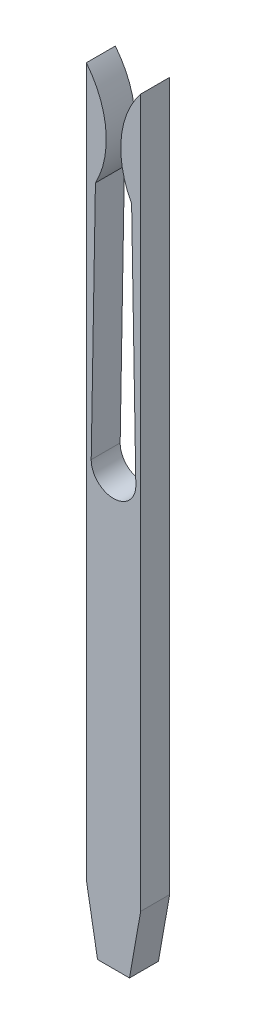
ISO-10303-21;
HEADER;
FILE_DESCRIPTION(('STEP AP214'),'2;1');
FILE_NAME('part.step','',(''),(''),'','','');
FILE_SCHEMA(('AUTOMOTIVE_DESIGN { 1 0 10303 214 1 1 1 1 }'));
ENDSEC;
DATA;
#1=APPLICATION_CONTEXT('core data for automotive mechanical design processes');
#2=APPLICATION_PROTOCOL_DEFINITION('international standard','automotive_design',2000,#1);
#3=PRODUCT_CONTEXT('',#1,'mechanical');
#4=PRODUCT('Part','Part','',(#3));
#5=PRODUCT_RELATED_PRODUCT_CATEGORY('part','',(#4));
#6=PRODUCT_DEFINITION_FORMATION('','',#4);
#7=PRODUCT_DEFINITION_CONTEXT('part definition',#1,'design');
#8=PRODUCT_DEFINITION('design','',#6,#7);
#9=PRODUCT_DEFINITION_SHAPE('','',#8);
#10=(LENGTH_UNIT() NAMED_UNIT(*) SI_UNIT(.MILLI.,.METRE.));
#11=(NAMED_UNIT(*) PLANE_ANGLE_UNIT() SI_UNIT($,.RADIAN.));
#12=(NAMED_UNIT(*) SI_UNIT($,.STERADIAN.) SOLID_ANGLE_UNIT());
#13=UNCERTAINTY_MEASURE_WITH_UNIT(LENGTH_MEASURE(1.E-05),#10,'distance_accuracy_value','');
#14=(GEOMETRIC_REPRESENTATION_CONTEXT(3) GLOBAL_UNCERTAINTY_ASSIGNED_CONTEXT((#13)) GLOBAL_UNIT_ASSIGNED_CONTEXT((#10,
#11,#12)) REPRESENTATION_CONTEXT('',''));
#15=CARTESIAN_POINT('',(0.,0.,0.));
#16=DIRECTION('',(0.,0.,1.));
#17=DIRECTION('',(1.,0.,0.));
#18=AXIS2_PLACEMENT_3D('',#15,#16,#17);
#19=CARTESIAN_POINT('',(6.35,2.827815455176,-1.0668));
#20=DIRECTION('',(0.,0.,-1.));
#21=DIRECTION('',(-1.,0.,0.));
#22=AXIS2_PLACEMENT_3D('',#19,#20,#21);
#23=CYLINDRICAL_SURFACE('',#22,0.313215455176);
#24=CARTESIAN_POINT('',(6.35,2.827815455176,-1.0668));
#25=DIRECTION('',(0.,0.,-1.));
#26=DIRECTION('',(1.,0.,0.));
#27=AXIS2_PLACEMENT_3D('',#24,#25,#26);
#28=CIRCLE('',#27,0.313215455176);
#29=CARTESIAN_POINT('',(6.66320054663875,2.83054876697699,-1.0668));
#30=VERTEX_POINT('',#29);
#31=CARTESIAN_POINT('',(6.0368083969395,2.830548636889,-1.0668));
#32=VERTEX_POINT('',#31);
#33=EDGE_CURVE('E200',#30,#32,#28,.T.);
#34=ORIENTED_EDGE('',*,*,#33,.F.);
#35=DIRECTION('',(0.,0.,-1.));
#36=VECTOR('',#35,1.);
#37=CARTESIAN_POINT('',(6.663167750945,2.833281818602,-1.0668));
#38=LINE('',#37,#36);
#39=CARTESIAN_POINT('',(6.66320054663875,2.83054876697699,-1.4732));
#40=VERTEX_POINT('',#39);
#41=EDGE_CURVE('E52',#30,#40,#38,.T.);
#42=ORIENTED_EDGE('',*,*,#41,.T.);
#43=CARTESIAN_POINT('',(6.35,2.827815455176,-1.4732));
#44=DIRECTION('',(0.,0.,-1.));
#45=DIRECTION('',(1.,0.,0.));
#46=AXIS2_PLACEMENT_3D('',#43,#44,#45);
#47=CIRCLE('',#46,0.313215455176);
#48=CARTESIAN_POINT('',(6.0368083969395,2.830548636889,-1.4732));
#49=VERTEX_POINT('',#48);
#50=EDGE_CURVE('E192',#40,#49,#47,.T.);
#51=ORIENTED_EDGE('',*,*,#50,.T.);
#52=DIRECTION('',(0.,0.,-1.));
#53=VECTOR('',#52,1.);
#54=CARTESIAN_POINT('',(6.036832249055,2.833281818602,-1.0668));
#55=LINE('',#54,#53);
#56=EDGE_CURVE('E39',#32,#49,#55,.T.);
#57=ORIENTED_EDGE('',*,*,#56,.F.);
#58=EDGE_LOOP('',(#34,#42,#51,#57));
#59=FACE_BOUND('',#58,.T.);
#60=ADVANCED_FACE('F17',(#59),#23,.F.);
#61=CARTESIAN_POINT('',(7.72190848735,6.825644682968,-1.0668));
#62=DIRECTION('',(0.,0.,-1.));
#63=DIRECTION('',(-1.,0.,0.));
#64=AXIS2_PLACEMENT_3D('',#61,#62,#63);
#65=CYLINDRICAL_SURFACE('',#64,1.27);
#66=CARTESIAN_POINT('',(7.72190848735,6.825644682968,-1.0668));
#67=DIRECTION('',(0.,0.,1.));
#68=DIRECTION('',(1.,0.,0.));
#69=AXIS2_PLACEMENT_3D('',#66,#67,#68);
#70=CIRCLE('',#69,1.27);
#71=CARTESIAN_POINT('',(6.731,7.62,-1.0668));
#72=VERTEX_POINT('',#71);
#73=CARTESIAN_POINT('',(6.604,6.223,-1.0668));
#74=VERTEX_POINT('',#73);
#75=EDGE_CURVE('E109',#72,#74,#70,.T.);
#76=ORIENTED_EDGE('',*,*,#75,.F.);
#77=DIRECTION('',(0.,0.,-1.));
#78=VECTOR('',#77,1.);
#79=CARTESIAN_POINT('',(6.731,7.62,-1.0668));
#80=LINE('',#79,#78);
#81=CARTESIAN_POINT('',(6.731,7.62,-1.4732));
#82=VERTEX_POINT('',#81);
#83=EDGE_CURVE('E93',#72,#82,#80,.T.);
#84=ORIENTED_EDGE('',*,*,#83,.T.);
#85=CARTESIAN_POINT('',(7.72190848735,6.825644682968,-1.4732));
#86=DIRECTION('',(0.,0.,1.));
#87=DIRECTION('',(1.,0.,0.));
#88=AXIS2_PLACEMENT_3D('',#85,#86,#87);
#89=CIRCLE('',#88,1.27);
#90=CARTESIAN_POINT('',(6.604,6.223,-1.4732));
#91=VERTEX_POINT('',#90);
#92=EDGE_CURVE('E132',#82,#91,#89,.T.);
#93=ORIENTED_EDGE('',*,*,#92,.T.);
#94=DIRECTION('',(0.,0.,-1.));
#95=VECTOR('',#94,1.);
#96=CARTESIAN_POINT('',(6.604,6.223,-1.0668));
#97=LINE('',#96,#95);
#98=EDGE_CURVE('E106',#74,#91,#97,.T.);
#99=ORIENTED_EDGE('',*,*,#98,.F.);
#100=EDGE_LOOP('',(#76,#84,#93,#99));
#101=FACE_BOUND('',#100,.T.);
#102=ADVANCED_FACE('F110',(#101),#65,.T.);
#103=CARTESIAN_POINT('',(4.97809151265,6.825644682968,-1.0668));
#104=DIRECTION('',(0.,0.,-1.));
#105=DIRECTION('',(-1.,0.,0.));
#106=AXIS2_PLACEMENT_3D('',#103,#104,#105);
#107=CYLINDRICAL_SURFACE('',#106,1.27);
#108=CARTESIAN_POINT('',(4.97809151265,6.825644682968,-1.4732));
#109=DIRECTION('',(0.,0.,1.));
#110=DIRECTION('',(-1.,0.,0.));
#111=AXIS2_PLACEMENT_3D('',#108,#109,#110);
#112=CIRCLE('',#111,1.27);
#113=CARTESIAN_POINT('',(6.096,6.223,-1.4732));
#114=VERTEX_POINT('',#113);
#115=CARTESIAN_POINT('',(5.969,7.62,-1.4732));
#116=VERTEX_POINT('',#115);
#117=EDGE_CURVE('E217',#114,#116,#112,.T.);
#118=ORIENTED_EDGE('',*,*,#117,.T.);
#119=DIRECTION('',(0.,0.,-1.));
#120=VECTOR('',#119,1.);
#121=CARTESIAN_POINT('',(5.969,7.62,-1.0668));
#122=LINE('',#121,#120);
#123=CARTESIAN_POINT('',(5.969,7.62,-1.0668));
#124=VERTEX_POINT('',#123);
#125=EDGE_CURVE('E11',#124,#116,#122,.T.);
#126=ORIENTED_EDGE('',*,*,#125,.F.);
#127=CARTESIAN_POINT('',(4.97809151265,6.825644682968,-1.0668));
#128=DIRECTION('',(0.,0.,1.));
#129=DIRECTION('',(-1.,0.,0.));
#130=AXIS2_PLACEMENT_3D('',#127,#128,#129);
#131=CIRCLE('',#130,1.27);
#132=CARTESIAN_POINT('',(6.096,6.223,-1.0668));
#133=VERTEX_POINT('',#132);
#134=EDGE_CURVE('E151',#133,#124,#131,.T.);
#135=ORIENTED_EDGE('',*,*,#134,.F.);
#136=DIRECTION('',(0.,0.,-1.));
#137=VECTOR('',#136,1.);
#138=CARTESIAN_POINT('',(6.096,6.223,-1.0668));
#139=LINE('',#138,#137);
#140=EDGE_CURVE('E167',#133,#114,#139,.T.);
#141=ORIENTED_EDGE('',*,*,#140,.T.);
#142=EDGE_LOOP('',(#118,#126,#135,#141));
#143=FACE_BOUND('',#142,.T.);
#144=ADVANCED_FACE('F227',(#143),#107,.T.);
#145=CARTESIAN_POINT('',(5.969,7.62,-1.0668));
#146=DIRECTION('',(1.,0.,0.));
#147=DIRECTION('',(0.,-1.,0.));
#148=AXIS2_PLACEMENT_3D('',#145,#146,#147);
#149=PLANE('',#148);
#150=DIRECTION('',(0.,-1.,0.));
#151=VECTOR('',#150,1.);
#152=CARTESIAN_POINT('',(5.969,7.62,-1.4732));
#153=LINE('',#152,#151);
#154=CARTESIAN_POINT('',(5.969,-2.3114,-1.4732));
#155=VERTEX_POINT('',#154);
#156=EDGE_CURVE('E148',#116,#155,#153,.T.);
#157=ORIENTED_EDGE('',*,*,#156,.T.);
#158=DIRECTION('',(0.,0.,-1.));
#159=VECTOR('',#158,1.);
#160=CARTESIAN_POINT('',(5.969,-2.3114,-1.0668));
#161=LINE('',#160,#159);
#162=CARTESIAN_POINT('',(5.969,-2.3114,-1.0668));
#163=VERTEX_POINT('',#162);
#164=EDGE_CURVE('E26',#163,#155,#161,.T.);
#165=ORIENTED_EDGE('',*,*,#164,.F.);
#166=DIRECTION('',(0.,-1.,0.));
#167=VECTOR('',#166,1.);
#168=CARTESIAN_POINT('',(5.969,7.62,-1.0668));
#169=LINE('',#168,#167);
#170=EDGE_CURVE('E154',#124,#163,#169,.T.);
#171=ORIENTED_EDGE('',*,*,#170,.F.);
#172=ORIENTED_EDGE('',*,*,#125,.T.);
#173=EDGE_LOOP('',(#157,#165,#171,#172));
#174=FACE_BOUND('',#173,.T.);
#175=ADVANCED_FACE('F234',(#174),#149,.F.);
#176=CARTESIAN_POINT('',(5.969,-2.3114,-1.0668));
#177=DIRECTION('',(0.98480775301219,0.173648177667033,0.));
#178=DIRECTION('',(0.,0.,-1.));
#179=AXIS2_PLACEMENT_3D('',#176,#177,#178);
#180=PLANE('',#179);
#181=DIRECTION('',(0.173648177667033,-0.98480775301219,0.));
#182=VECTOR('',#181,1.);
#183=CARTESIAN_POINT('',(5.969,-2.3114,-1.4732));
#184=LINE('',#183,#182);
#185=CARTESIAN_POINT('',(6.12575468585,-3.2004,-1.4732));
#186=VERTEX_POINT('',#185);
#187=EDGE_CURVE('E138',#155,#186,#184,.T.);
#188=ORIENTED_EDGE('',*,*,#187,.T.);
#189=DIRECTION('',(0.,0.,-1.));
#190=VECTOR('',#189,1.);
#191=CARTESIAN_POINT('',(6.12575468585,-3.2004,-1.0668));
#192=LINE('',#191,#190);
#193=CARTESIAN_POINT('',(6.12575468585,-3.2004,-1.0668));
#194=VERTEX_POINT('',#193);
#195=EDGE_CURVE('E178',#194,#186,#192,.T.);
#196=ORIENTED_EDGE('',*,*,#195,.F.);
#197=DIRECTION('',(0.173648177667033,-0.98480775301219,0.));
#198=VECTOR('',#197,1.);
#199=CARTESIAN_POINT('',(5.969,-2.3114,-1.0668));
#200=LINE('',#199,#198);
#201=EDGE_CURVE('E161',#163,#194,#200,.T.);
#202=ORIENTED_EDGE('',*,*,#201,.F.);
#203=ORIENTED_EDGE('',*,*,#164,.T.);
#204=EDGE_LOOP('',(#188,#196,#202,#203));
#205=FACE_BOUND('',#204,.T.);
#206=ADVANCED_FACE('F241',(#205),#180,.F.);
#207=CARTESIAN_POINT('',(6.57424531415,-3.2004,-1.0668));
#208=DIRECTION('',(0.,1.,0.));
#209=DIRECTION('',(1.,0.,0.));
#210=AXIS2_PLACEMENT_3D('',#207,#208,#209);
#211=PLANE('',#210);
#212=DIRECTION('',(1.,0.,0.));
#213=VECTOR('',#212,1.);
#214=CARTESIAN_POINT('',(6.57424531415,-3.2004,-1.4732));
#215=LINE('',#214,#213);
#216=CARTESIAN_POINT('',(6.57424531415,-3.2004,-1.4732));
#217=VERTEX_POINT('',#216);
#218=EDGE_CURVE('E134',#186,#217,#215,.T.);
#219=ORIENTED_EDGE('',*,*,#218,.T.);
#220=DIRECTION('',(0.,0.,-1.));
#221=VECTOR('',#220,1.);
#222=CARTESIAN_POINT('',(6.57424531415,-3.2004,-1.0668));
#223=LINE('',#222,#221);
#224=CARTESIAN_POINT('',(6.57424531415,-3.2004,-1.0668));
#225=VERTEX_POINT('',#224);
#226=EDGE_CURVE('E173',#225,#217,#223,.T.);
#227=ORIENTED_EDGE('',*,*,#226,.F.);
#228=DIRECTION('',(1.,0.,0.));
#229=VECTOR('',#228,1.);
#230=CARTESIAN_POINT('',(6.57424531415,-3.2004,-1.0668));
#231=LINE('',#230,#229);
#232=EDGE_CURVE('E128',#194,#225,#231,.T.);
#233=ORIENTED_EDGE('',*,*,#232,.F.);
#234=ORIENTED_EDGE('',*,*,#195,.T.);
#235=EDGE_LOOP('',(#219,#227,#233,#234));
#236=FACE_BOUND('',#235,.T.);
#237=ADVANCED_FACE('F245',(#236),#211,.F.);
#238=CARTESIAN_POINT('',(6.731,-2.3114,-1.0668));
#239=DIRECTION('',(-0.98480775301219,0.173648177667033,0.));
#240=DIRECTION('',(0.,0.,1.));
#241=AXIS2_PLACEMENT_3D('',#238,#239,#240);
#242=PLANE('',#241);
#243=DIRECTION('',(0.173648177667033,0.98480775301219,0.));
#244=VECTOR('',#243,1.);
#245=CARTESIAN_POINT('',(6.731,-2.3114,-1.4732));
#246=LINE('',#245,#244);
#247=CARTESIAN_POINT('',(6.731,-2.3114,-1.4732));
#248=VERTEX_POINT('',#247);
#249=EDGE_CURVE('E139',#217,#248,#246,.T.);
#250=ORIENTED_EDGE('',*,*,#249,.T.);
#251=DIRECTION('',(0.,0.,-1.));
#252=VECTOR('',#251,1.);
#253=CARTESIAN_POINT('',(6.731,-2.3114,-1.0668));
#254=LINE('',#253,#252);
#255=CARTESIAN_POINT('',(6.731,-2.3114,-1.0668));
#256=VERTEX_POINT('',#255);
#257=EDGE_CURVE('E105',#256,#248,#254,.T.);
#258=ORIENTED_EDGE('',*,*,#257,.F.);
#259=DIRECTION('',(0.173648177667033,0.98480775301219,0.));
#260=VECTOR('',#259,1.);
#261=CARTESIAN_POINT('',(6.731,-2.3114,-1.0668));
#262=LINE('',#261,#260);
#263=EDGE_CURVE('E121',#225,#256,#262,.T.);
#264=ORIENTED_EDGE('',*,*,#263,.F.);
#265=ORIENTED_EDGE('',*,*,#226,.T.);
#266=EDGE_LOOP('',(#250,#258,#264,#265));
#267=FACE_BOUND('',#266,.T.);
#268=ADVANCED_FACE('F248',(#267),#242,.F.);
#269=CARTESIAN_POINT('',(6.731,7.62,-1.0668));
#270=DIRECTION('',(-1.,0.,0.));
#271=DIRECTION('',(0.,1.,0.));
#272=AXIS2_PLACEMENT_3D('',#269,#270,#271);
#273=PLANE('',#272);
#274=DIRECTION('',(0.,1.,0.));
#275=VECTOR('',#274,1.);
#276=CARTESIAN_POINT('',(6.731,7.62,-1.4732));
#277=LINE('',#276,#275);
#278=EDGE_CURVE('E100',#248,#82,#277,.T.);
#279=ORIENTED_EDGE('',*,*,#278,.T.);
#280=ORIENTED_EDGE('',*,*,#83,.F.);
#281=DIRECTION('',(0.,1.,0.));
#282=VECTOR('',#281,1.);
#283=CARTESIAN_POINT('',(6.731,7.62,-1.0668));
#284=LINE('',#283,#282);
#285=EDGE_CURVE('E97',#256,#72,#284,.T.);
#286=ORIENTED_EDGE('',*,*,#285,.F.);
#287=ORIENTED_EDGE('',*,*,#257,.T.);
#288=EDGE_LOOP('',(#279,#280,#286,#287));
#289=FACE_BOUND('',#288,.T.);
#290=ADVANCED_FACE('F95',(#289),#273,.F.);
#291=CARTESIAN_POINT('',(6.604,6.223,-1.0668));
#292=DIRECTION('',(0.999847695156391,0.0174524064372869,0.));
#293=DIRECTION('',(0.,0.,-1.));
#294=AXIS2_PLACEMENT_3D('',#291,#292,#293);
#295=PLANE('',#294);
#296=DIRECTION('',(0.0174524064372869,-0.999847695156391,0.));
#297=VECTOR('',#296,1.);
#298=CARTESIAN_POINT('',(6.604,6.223,-1.4732));
#299=LINE('',#298,#297);
#300=EDGE_CURVE('E189',#91,#40,#299,.T.);
#301=ORIENTED_EDGE('',*,*,#300,.T.);
#302=ORIENTED_EDGE('',*,*,#41,.F.);
#303=DIRECTION('',(0.0174524064372869,-0.999847695156391,0.));
#304=VECTOR('',#303,1.);
#305=CARTESIAN_POINT('',(6.604,6.223,-1.0668));
#306=LINE('',#305,#304);
#307=EDGE_CURVE('E115',#74,#30,#306,.T.);
#308=ORIENTED_EDGE('',*,*,#307,.F.);
#309=ORIENTED_EDGE('',*,*,#98,.T.);
#310=EDGE_LOOP('',(#301,#302,#308,#309));
#311=FACE_BOUND('',#310,.T.);
#312=ADVANCED_FACE('F384',(#311),#295,.F.);
#313=CARTESIAN_POINT('',(6.096,6.223,-1.0668));
#314=DIRECTION('',(-0.999847695156391,0.0174524064372869,0.));
#315=DIRECTION('',(0.,0.,1.));
#316=AXIS2_PLACEMENT_3D('',#313,#314,#315);
#317=PLANE('',#316);
#318=DIRECTION('',(0.0174524064372869,0.999847695156391,0.));
#319=VECTOR('',#318,1.);
#320=CARTESIAN_POINT('',(6.096,6.223,-1.4732));
#321=LINE('',#320,#319);
#322=EDGE_CURVE('E197',#49,#114,#321,.T.);
#323=ORIENTED_EDGE('',*,*,#322,.T.);
#324=ORIENTED_EDGE('',*,*,#140,.F.);
#325=DIRECTION('',(0.0174524064372869,0.999847695156391,0.));
#326=VECTOR('',#325,1.);
#327=CARTESIAN_POINT('',(6.096,6.223,-1.0668));
#328=LINE('',#327,#326);
#329=EDGE_CURVE('E171',#32,#133,#328,.T.);
#330=ORIENTED_EDGE('',*,*,#329,.F.);
#331=ORIENTED_EDGE('',*,*,#56,.T.);
#332=EDGE_LOOP('',(#323,#324,#330,#331));
#333=FACE_BOUND('',#332,.T.);
#334=ADVANCED_FACE('F367',(#333),#317,.F.);
#335=CARTESIAN_POINT('',(4.97809151265,6.825644682968,-1.0668));
#336=DIRECTION('',(0.,0.,-1.));
#337=DIRECTION('',(0.,-1.,0.));
#338=AXIS2_PLACEMENT_3D('',#335,#336,#337);
#339=PLANE('',#338);
#340=ORIENTED_EDGE('',*,*,#134,.T.);
#341=ORIENTED_EDGE('',*,*,#170,.T.);
#342=ORIENTED_EDGE('',*,*,#201,.T.);
#343=ORIENTED_EDGE('',*,*,#232,.T.);
#344=ORIENTED_EDGE('',*,*,#263,.T.);
#345=ORIENTED_EDGE('',*,*,#285,.T.);
#346=ORIENTED_EDGE('',*,*,#75,.T.);
#347=ORIENTED_EDGE('',*,*,#307,.T.);
#348=ORIENTED_EDGE('',*,*,#33,.T.);
#349=ORIENTED_EDGE('',*,*,#329,.T.);
#350=EDGE_LOOP('',(#340,#341,#342,#343,#344,#345,#346,#347,#348,#349));
#351=FACE_BOUND('',#350,.T.);
#352=ADVANCED_FACE('F118',(#351),#339,.F.);
#353=CARTESIAN_POINT('',(4.97809151265,6.825644682968,-1.4732));
#354=DIRECTION('',(0.,0.,-1.));
#355=DIRECTION('',(0.,-1.,0.));
#356=AXIS2_PLACEMENT_3D('',#353,#354,#355);
#357=PLANE('',#356);
#358=ORIENTED_EDGE('',*,*,#117,.F.);
#359=ORIENTED_EDGE('',*,*,#322,.F.);
#360=ORIENTED_EDGE('',*,*,#50,.F.);
#361=ORIENTED_EDGE('',*,*,#300,.F.);
#362=ORIENTED_EDGE('',*,*,#92,.F.);
#363=ORIENTED_EDGE('',*,*,#278,.F.);
#364=ORIENTED_EDGE('',*,*,#249,.F.);
#365=ORIENTED_EDGE('',*,*,#218,.F.);
#366=ORIENTED_EDGE('',*,*,#187,.F.);
#367=ORIENTED_EDGE('',*,*,#156,.F.);
#368=EDGE_LOOP('',(#358,#359,#360,#361,#362,#363,#364,#365,#366,#367));
#369=FACE_BOUND('',#368,.T.);
#370=ADVANCED_FACE('F250',(#369),#357,.T.);
#371=CLOSED_SHELL('',(#60,#102,#144,#175,#206,#237,#268,#290,#312,#334,#352,#370));
#372=MANIFOLD_SOLID_BREP('B1',#371);
#373=ADVANCED_BREP_SHAPE_REPRESENTATION('',(#18,#372),#14);
#374=SHAPE_DEFINITION_REPRESENTATION(#9,#373);
ENDSEC;
END-ISO-10303-21;
